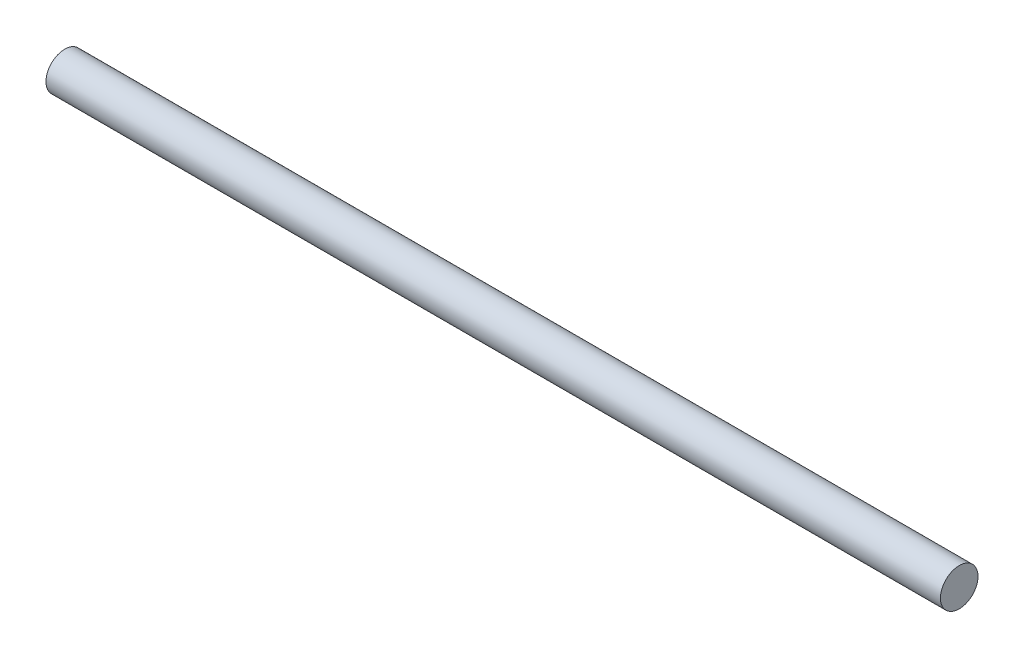
ISO-10303-21;
HEADER;
FILE_DESCRIPTION(('STEP AP214'),'2;1');
FILE_NAME('part.step','',(''),(''),'','','');
FILE_SCHEMA(('AUTOMOTIVE_DESIGN { 1 0 10303 214 1 1 1 1 }'));
ENDSEC;
DATA;
#1=APPLICATION_CONTEXT('core data for automotive mechanical design processes');
#2=APPLICATION_PROTOCOL_DEFINITION('international standard','automotive_design',2000,#1);
#3=PRODUCT_CONTEXT('',#1,'mechanical');
#4=PRODUCT('Part','Part','',(#3));
#5=PRODUCT_RELATED_PRODUCT_CATEGORY('part','',(#4));
#6=PRODUCT_DEFINITION_FORMATION('','',#4);
#7=PRODUCT_DEFINITION_CONTEXT('part definition',#1,'design');
#8=PRODUCT_DEFINITION('design','',#6,#7);
#9=PRODUCT_DEFINITION_SHAPE('','',#8);
#10=(LENGTH_UNIT() NAMED_UNIT(*) SI_UNIT(.MILLI.,.METRE.));
#11=(NAMED_UNIT(*) PLANE_ANGLE_UNIT() SI_UNIT($,.RADIAN.));
#12=(NAMED_UNIT(*) SI_UNIT($,.STERADIAN.) SOLID_ANGLE_UNIT());
#13=UNCERTAINTY_MEASURE_WITH_UNIT(LENGTH_MEASURE(1.E-05),#10,'distance_accuracy_value','');
#14=(GEOMETRIC_REPRESENTATION_CONTEXT(3) GLOBAL_UNCERTAINTY_ASSIGNED_CONTEXT((#13)) GLOBAL_UNIT_ASSIGNED_CONTEXT((#10,
#11,#12)) REPRESENTATION_CONTEXT('',''));
#15=CARTESIAN_POINT('',(0.,0.,0.));
#16=DIRECTION('',(0.,0.,1.));
#17=DIRECTION('',(1.,0.,0.));
#18=AXIS2_PLACEMENT_3D('',#15,#16,#17);
#19=CARTESIAN_POINT('',(127.,0.,0.));
#20=DIRECTION('',(-1.,0.,0.));
#21=DIRECTION('',(0.,0.,1.));
#22=AXIS2_PLACEMENT_3D('',#19,#20,#21);
#23=CYLINDRICAL_SURFACE('',#22,2.667);
#24=CARTESIAN_POINT('',(127.,0.,0.));
#25=DIRECTION('',(1.,0.,0.));
#26=DIRECTION('',(0.,0.,-1.));
#27=AXIS2_PLACEMENT_3D('',#24,#25,#26);
#28=CIRCLE('',#27,2.667);
#29=CARTESIAN_POINT('',(127.,0.,-2.667));
#30=VERTEX_POINT('',#29);
#31=EDGE_CURVE('E10',#30,#30,#28,.T.);
#32=ORIENTED_EDGE('',*,*,#31,.F.);
#33=EDGE_LOOP('',(#32));
#34=FACE_BOUND('',#33,.T.);
#35=CARTESIAN_POINT('',(0.,0.,0.));
#36=DIRECTION('',(1.,0.,0.));
#37=DIRECTION('',(0.,0.,-1.));
#38=AXIS2_PLACEMENT_3D('',#35,#36,#37);
#39=CIRCLE('',#38,2.667);
#40=CARTESIAN_POINT('',(0.,0.,-2.667));
#41=VERTEX_POINT('',#40);
#42=EDGE_CURVE('E34',#41,#41,#39,.T.);
#43=ORIENTED_EDGE('',*,*,#42,.T.);
#44=EDGE_LOOP('',(#43));
#45=FACE_BOUND('',#44,.T.);
#46=ADVANCED_FACE('F31',(#34,#45),#23,.T.);
#47=CARTESIAN_POINT('',(127.,0.,0.));
#48=DIRECTION('',(1.,0.,0.));
#49=DIRECTION('',(0.,0.,-1.));
#50=AXIS2_PLACEMENT_3D('',#47,#48,#49);
#51=PLANE('',#50);
#52=ORIENTED_EDGE('',*,*,#31,.T.);
#53=EDGE_LOOP('',(#52));
#54=FACE_BOUND('',#53,.T.);
#55=ADVANCED_FACE('F46',(#54),#51,.T.);
#56=CARTESIAN_POINT('',(0.,0.,0.));
#57=DIRECTION('',(1.,0.,0.));
#58=DIRECTION('',(0.,0.,-1.));
#59=AXIS2_PLACEMENT_3D('',#56,#57,#58);
#60=PLANE('',#59);
#61=ORIENTED_EDGE('',*,*,#42,.F.);
#62=EDGE_LOOP('',(#61));
#63=FACE_BOUND('',#62,.T.);
#64=ADVANCED_FACE('F44',(#63),#60,.F.);
#65=CLOSED_SHELL('',(#46,#55,#64));
#66=MANIFOLD_SOLID_BREP('B2',#65);
#67=ADVANCED_BREP_SHAPE_REPRESENTATION('',(#18,#66),#14);
#68=SHAPE_DEFINITION_REPRESENTATION(#9,#67);
ENDSEC;
END-ISO-10303-21;
